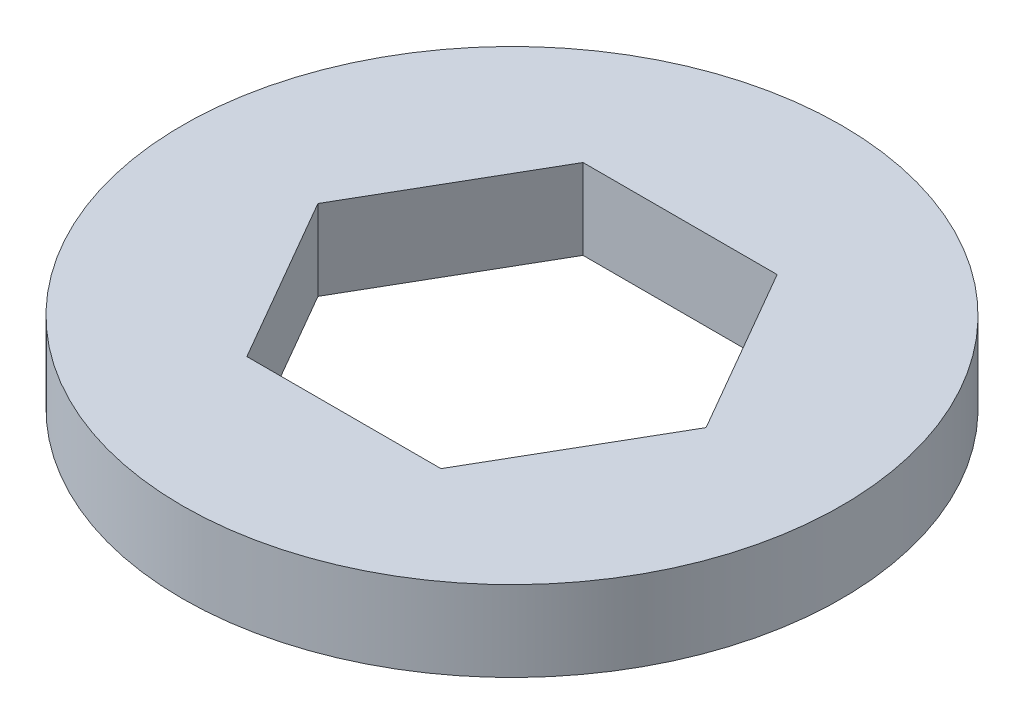
ISO-10303-21;
HEADER;
FILE_DESCRIPTION(('STEP AP214'),'2;1');
FILE_NAME('part.step','',(''),(''),'','','');
FILE_SCHEMA(('AUTOMOTIVE_DESIGN { 1 0 10303 214 1 1 1 1 }'));
ENDSEC;
DATA;
#1=APPLICATION_CONTEXT('core data for automotive mechanical design processes');
#2=APPLICATION_PROTOCOL_DEFINITION('international standard','automotive_design',2000,#1);
#3=PRODUCT_CONTEXT('',#1,'mechanical');
#4=PRODUCT('Part','Part','',(#3));
#5=PRODUCT_RELATED_PRODUCT_CATEGORY('part','',(#4));
#6=PRODUCT_DEFINITION_FORMATION('','',#4);
#7=PRODUCT_DEFINITION_CONTEXT('part definition',#1,'design');
#8=PRODUCT_DEFINITION('design','',#6,#7);
#9=PRODUCT_DEFINITION_SHAPE('','',#8);
#10=(LENGTH_UNIT() NAMED_UNIT(*) SI_UNIT(.MILLI.,.METRE.));
#11=(NAMED_UNIT(*) PLANE_ANGLE_UNIT() SI_UNIT($,.RADIAN.));
#12=(NAMED_UNIT(*) SI_UNIT($,.STERADIAN.) SOLID_ANGLE_UNIT());
#13=UNCERTAINTY_MEASURE_WITH_UNIT(LENGTH_MEASURE(1.E-05),#10,'distance_accuracy_value','');
#14=(GEOMETRIC_REPRESENTATION_CONTEXT(3) GLOBAL_UNCERTAINTY_ASSIGNED_CONTEXT((#13)) GLOBAL_UNIT_ASSIGNED_CONTEXT((#10,
#11,#12)) REPRESENTATION_CONTEXT('',''));
#15=CARTESIAN_POINT('',(0.,0.,0.));
#16=DIRECTION('',(0.,0.,1.));
#17=DIRECTION('',(1.,0.,0.));
#18=AXIS2_PLACEMENT_3D('',#15,#16,#17);
#19=CARTESIAN_POINT('',(5.60924654031181,3.1,-3.2385));
#20=DIRECTION('',(-0.866025403784438,0.,0.5));
#21=DIRECTION('',(0.5,0.,0.866025403784439));
#22=AXIS2_PLACEMENT_3D('',#19,#20,#21);
#23=PLANE('',#22);
#24=DIRECTION('',(-0.5,0.,-0.866025403784439));
#25=VECTOR('',#24,1.);
#26=CARTESIAN_POINT('',(5.60924654031181,0.,-3.2385));
#27=LINE('',#26,#25);
#28=CARTESIAN_POINT('',(7.47899538708241,0.,0.));
#29=VERTEX_POINT('',#28);
#30=CARTESIAN_POINT('',(3.7394976935412,0.,-6.477));
#31=VERTEX_POINT('',#30);
#32=EDGE_CURVE('E120',#29,#31,#27,.T.);
#33=ORIENTED_EDGE('',*,*,#32,.F.);
#34=DIRECTION('',(0.,-1.,0.));
#35=VECTOR('',#34,1.);
#36=CARTESIAN_POINT('',(7.47899538708241,3.1,0.));
#37=LINE('',#36,#35);
#38=CARTESIAN_POINT('',(7.47899538708241,3.1,0.));
#39=VERTEX_POINT('',#38);
#40=EDGE_CURVE('E11',#39,#29,#37,.T.);
#41=ORIENTED_EDGE('',*,*,#40,.F.);
#42=DIRECTION('',(-0.5,0.,-0.866025403784439));
#43=VECTOR('',#42,1.);
#44=CARTESIAN_POINT('',(5.60924654031181,3.1,-3.2385));
#45=LINE('',#44,#43);
#46=CARTESIAN_POINT('',(3.7394976935412,3.1,-6.477));
#47=VERTEX_POINT('',#46);
#48=EDGE_CURVE('E137',#39,#47,#45,.T.);
#49=ORIENTED_EDGE('',*,*,#48,.T.);
#50=DIRECTION('',(0.,-1.,0.));
#51=VECTOR('',#50,1.);
#52=CARTESIAN_POINT('',(3.7394976935412,3.1,-6.477));
#53=LINE('',#52,#51);
#54=EDGE_CURVE('E51',#47,#31,#53,.T.);
#55=ORIENTED_EDGE('',*,*,#54,.T.);
#56=EDGE_LOOP('',(#33,#41,#49,#55));
#57=FACE_BOUND('',#56,.T.);
#58=ADVANCED_FACE('F35',(#57),#23,.T.);
#59=CARTESIAN_POINT('',(5.60924654031181,3.1,3.2385));
#60=DIRECTION('',(-0.866025403784439,0.,-0.5));
#61=DIRECTION('',(-0.5,0.,0.866025403784439));
#62=AXIS2_PLACEMENT_3D('',#59,#60,#61);
#63=PLANE('',#62);
#64=DIRECTION('',(0.5,0.,-0.866025403784439));
#65=VECTOR('',#64,1.);
#66=CARTESIAN_POINT('',(5.60924654031181,0.,3.2385));
#67=LINE('',#66,#65);
#68=CARTESIAN_POINT('',(3.73949769354121,0.,6.477));
#69=VERTEX_POINT('',#68);
#70=EDGE_CURVE('E122',#69,#29,#67,.T.);
#71=ORIENTED_EDGE('',*,*,#70,.F.);
#72=DIRECTION('',(0.,-1.,0.));
#73=VECTOR('',#72,1.);
#74=CARTESIAN_POINT('',(3.73949769354121,3.1,6.477));
#75=LINE('',#74,#73);
#76=CARTESIAN_POINT('',(3.73949769354121,3.1,6.477));
#77=VERTEX_POINT('',#76);
#78=EDGE_CURVE('E43',#77,#69,#75,.T.);
#79=ORIENTED_EDGE('',*,*,#78,.F.);
#80=DIRECTION('',(0.5,0.,-0.866025403784439));
#81=VECTOR('',#80,1.);
#82=CARTESIAN_POINT('',(5.60924654031181,3.1,3.2385));
#83=LINE('',#82,#81);
#84=EDGE_CURVE('E226',#77,#39,#83,.T.);
#85=ORIENTED_EDGE('',*,*,#84,.T.);
#86=ORIENTED_EDGE('',*,*,#40,.T.);
#87=EDGE_LOOP('',(#71,#79,#85,#86));
#88=FACE_BOUND('',#87,.T.);
#89=ADVANCED_FACE('F146',(#88),#63,.T.);
#90=CARTESIAN_POINT('',(0.,3.1,6.477));
#91=DIRECTION('',(0.,0.,-1.));
#92=DIRECTION('',(-1.,0.,0.));
#93=AXIS2_PLACEMENT_3D('',#90,#91,#92);
#94=PLANE('',#93);
#95=DIRECTION('',(1.,0.,0.));
#96=VECTOR('',#95,1.);
#97=CARTESIAN_POINT('',(0.,0.,6.477));
#98=LINE('',#97,#96);
#99=CARTESIAN_POINT('',(-3.7394976935412,0.,6.477));
#100=VERTEX_POINT('',#99);
#101=EDGE_CURVE('E125',#100,#69,#98,.T.);
#102=ORIENTED_EDGE('',*,*,#101,.F.);
#103=DIRECTION('',(0.,-1.,0.));
#104=VECTOR('',#103,1.);
#105=CARTESIAN_POINT('',(-3.7394976935412,3.1,6.477));
#106=LINE('',#105,#104);
#107=CARTESIAN_POINT('',(-3.7394976935412,3.1,6.477));
#108=VERTEX_POINT('',#107);
#109=EDGE_CURVE('E98',#108,#100,#106,.T.);
#110=ORIENTED_EDGE('',*,*,#109,.F.);
#111=DIRECTION('',(1.,0.,0.));
#112=VECTOR('',#111,1.);
#113=CARTESIAN_POINT('',(0.,3.1,6.477));
#114=LINE('',#113,#112);
#115=EDGE_CURVE('E109',#108,#77,#114,.T.);
#116=ORIENTED_EDGE('',*,*,#115,.T.);
#117=ORIENTED_EDGE('',*,*,#78,.T.);
#118=EDGE_LOOP('',(#102,#110,#116,#117));
#119=FACE_BOUND('',#118,.T.);
#120=ADVANCED_FACE('F143',(#119),#94,.T.);
#121=CARTESIAN_POINT('',(-5.60924654031181,3.1,3.2385));
#122=DIRECTION('',(0.866025403784438,0.,-0.5));
#123=DIRECTION('',(-0.5,0.,-0.866025403784439));
#124=AXIS2_PLACEMENT_3D('',#121,#122,#123);
#125=PLANE('',#124);
#126=DIRECTION('',(0.5,0.,0.866025403784439));
#127=VECTOR('',#126,1.);
#128=CARTESIAN_POINT('',(-5.60924654031181,0.,3.2385));
#129=LINE('',#128,#127);
#130=CARTESIAN_POINT('',(-7.47899538708241,0.,0.));
#131=VERTEX_POINT('',#130);
#132=EDGE_CURVE('E94',#131,#100,#129,.T.);
#133=ORIENTED_EDGE('',*,*,#132,.F.);
#134=DIRECTION('',(0.,-1.,0.));
#135=VECTOR('',#134,1.);
#136=CARTESIAN_POINT('',(-7.47899538708241,3.1,0.));
#137=LINE('',#136,#135);
#138=CARTESIAN_POINT('',(-7.47899538708241,3.1,0.));
#139=VERTEX_POINT('',#138);
#140=EDGE_CURVE('E89',#139,#131,#137,.T.);
#141=ORIENTED_EDGE('',*,*,#140,.F.);
#142=DIRECTION('',(0.5,0.,0.866025403784439));
#143=VECTOR('',#142,1.);
#144=CARTESIAN_POINT('',(-5.60924654031181,3.1,3.2385));
#145=LINE('',#144,#143);
#146=EDGE_CURVE('E92',#139,#108,#145,.T.);
#147=ORIENTED_EDGE('',*,*,#146,.T.);
#148=ORIENTED_EDGE('',*,*,#109,.T.);
#149=EDGE_LOOP('',(#133,#141,#147,#148));
#150=FACE_BOUND('',#149,.T.);
#151=ADVANCED_FACE('F91',(#150),#125,.T.);
#152=CARTESIAN_POINT('',(-5.60924654031181,3.1,-3.2385));
#153=DIRECTION('',(0.866025403784439,0.,0.5));
#154=DIRECTION('',(0.5,0.,-0.866025403784439));
#155=AXIS2_PLACEMENT_3D('',#152,#153,#154);
#156=PLANE('',#155);
#157=DIRECTION('',(-0.5,0.,0.866025403784439));
#158=VECTOR('',#157,1.);
#159=CARTESIAN_POINT('',(-5.60924654031181,0.,-3.2385));
#160=LINE('',#159,#158);
#161=CARTESIAN_POINT('',(-3.7394976935412,0.,-6.477));
#162=VERTEX_POINT('',#161);
#163=EDGE_CURVE('E129',#162,#131,#160,.T.);
#164=ORIENTED_EDGE('',*,*,#163,.F.);
#165=DIRECTION('',(0.,-1.,0.));
#166=VECTOR('',#165,1.);
#167=CARTESIAN_POINT('',(-3.7394976935412,3.1,-6.477));
#168=LINE('',#167,#166);
#169=CARTESIAN_POINT('',(-3.7394976935412,3.1,-6.477));
#170=VERTEX_POINT('',#169);
#171=EDGE_CURVE('E70',#170,#162,#168,.T.);
#172=ORIENTED_EDGE('',*,*,#171,.F.);
#173=DIRECTION('',(-0.5,0.,0.866025403784439));
#174=VECTOR('',#173,1.);
#175=CARTESIAN_POINT('',(-5.60924654031181,3.1,-3.2385));
#176=LINE('',#175,#174);
#177=EDGE_CURVE('E106',#170,#139,#176,.T.);
#178=ORIENTED_EDGE('',*,*,#177,.T.);
#179=ORIENTED_EDGE('',*,*,#140,.T.);
#180=EDGE_LOOP('',(#164,#172,#178,#179));
#181=FACE_BOUND('',#180,.T.);
#182=ADVANCED_FACE('F111',(#181),#156,.T.);
#183=CARTESIAN_POINT('',(0.,3.1,-6.477));
#184=DIRECTION('',(0.,0.,1.));
#185=DIRECTION('',(1.,0.,0.));
#186=AXIS2_PLACEMENT_3D('',#183,#184,#185);
#187=PLANE('',#186);
#188=DIRECTION('',(-1.,0.,0.));
#189=VECTOR('',#188,1.);
#190=CARTESIAN_POINT('',(0.,0.,-6.477));
#191=LINE('',#190,#189);
#192=EDGE_CURVE('E131',#31,#162,#191,.T.);
#193=ORIENTED_EDGE('',*,*,#192,.F.);
#194=ORIENTED_EDGE('',*,*,#54,.F.);
#195=DIRECTION('',(-1.,0.,0.));
#196=VECTOR('',#195,1.);
#197=CARTESIAN_POINT('',(0.,3.1,-6.477));
#198=LINE('',#197,#196);
#199=EDGE_CURVE('E112',#47,#170,#198,.T.);
#200=ORIENTED_EDGE('',*,*,#199,.T.);
#201=ORIENTED_EDGE('',*,*,#171,.T.);
#202=EDGE_LOOP('',(#193,#194,#200,#201));
#203=FACE_BOUND('',#202,.T.);
#204=ADVANCED_FACE('F150',(#203),#187,.T.);
#205=CARTESIAN_POINT('',(0.,3.1,0.));
#206=DIRECTION('',(0.,-1.,0.));
#207=DIRECTION('',(0.,0.,-1.));
#208=AXIS2_PLACEMENT_3D('',#205,#206,#207);
#209=CYLINDRICAL_SURFACE('',#208,12.7);
#210=CARTESIAN_POINT('',(0.,3.1,0.));
#211=DIRECTION('',(0.,1.,0.));
#212=DIRECTION('',(0.,0.,1.));
#213=AXIS2_PLACEMENT_3D('',#210,#211,#212);
#214=CIRCLE('',#213,12.7);
#215=CARTESIAN_POINT('',(0.,3.1,-12.7));
#216=VERTEX_POINT('',#215);
#217=EDGE_CURVE('E114',#216,#216,#214,.T.);
#218=CARTESIAN_POINT('',(0.,0.,0.));
#219=DIRECTION('',(0.,1.,0.));
#220=DIRECTION('',(0.,0.,1.));
#221=AXIS2_PLACEMENT_3D('',#218,#219,#220);
#222=CIRCLE('',#221,12.7);
#223=CARTESIAN_POINT('',(0.,0.,-12.7));
#224=VERTEX_POINT('',#223);
#225=EDGE_CURVE('E134',#224,#224,#222,.T.);
#226=CARTESIAN_POINT('',(0.,3.1,-12.7));
#227=CARTESIAN_POINT('',(0.,3.06770833333333,-12.7));
#228=CARTESIAN_POINT('',(0.,3.03541666666667,-12.7));
#229=CARTESIAN_POINT('',(0.,2.97083333333333,-12.7));
#230=CARTESIAN_POINT('',(0.,2.93854166666667,-12.7));
#231=CARTESIAN_POINT('',(0.,2.87395833333333,-12.7));
#232=CARTESIAN_POINT('',(0.,2.84166666666667,-12.7));
#233=CARTESIAN_POINT('',(0.,2.77708333333333,-12.7));
#234=CARTESIAN_POINT('',(0.,2.74479166666667,-12.7));
#235=CARTESIAN_POINT('',(0.,2.68020833333333,-12.7));
#236=CARTESIAN_POINT('',(0.,2.64791666666667,-12.7));
#237=CARTESIAN_POINT('',(0.,2.58333333333333,-12.7));
#238=CARTESIAN_POINT('',(0.,2.55104166666667,-12.7));
#239=CARTESIAN_POINT('',(0.,2.48645833333333,-12.7));
#240=CARTESIAN_POINT('',(0.,2.45416666666667,-12.7));
#241=CARTESIAN_POINT('',(0.,2.38958333333333,-12.7));
#242=CARTESIAN_POINT('',(0.,2.35729166666667,-12.7));
#243=CARTESIAN_POINT('',(0.,2.29270833333333,-12.7));
#244=CARTESIAN_POINT('',(0.,2.26041666666667,-12.7));
#245=CARTESIAN_POINT('',(0.,2.19583333333333,-12.7));
#246=CARTESIAN_POINT('',(0.,2.16354166666667,-12.7));
#247=CARTESIAN_POINT('',(0.,2.09895833333333,-12.7));
#248=CARTESIAN_POINT('',(0.,2.06666666666667,-12.7));
#249=CARTESIAN_POINT('',(0.,2.00208333333333,-12.7));
#250=CARTESIAN_POINT('',(0.,1.96979166666667,-12.7));
#251=CARTESIAN_POINT('',(0.,1.90520833333333,-12.7));
#252=CARTESIAN_POINT('',(0.,1.87291666666667,-12.7));
#253=CARTESIAN_POINT('',(0.,1.80833333333333,-12.7));
#254=CARTESIAN_POINT('',(0.,1.77604166666667,-12.7));
#255=CARTESIAN_POINT('',(0.,1.71145833333333,-12.7));
#256=CARTESIAN_POINT('',(0.,1.67916666666667,-12.7));
#257=CARTESIAN_POINT('',(0.,1.61458333333333,-12.7));
#258=CARTESIAN_POINT('',(0.,1.58229166666667,-12.7));
#259=CARTESIAN_POINT('',(0.,1.51770833333333,-12.7));
#260=CARTESIAN_POINT('',(0.,1.48541666666667,-12.7));
#261=CARTESIAN_POINT('',(0.,1.42083333333333,-12.7));
#262=CARTESIAN_POINT('',(0.,1.38854166666667,-12.7));
#263=CARTESIAN_POINT('',(0.,1.32395833333333,-12.7));
#264=CARTESIAN_POINT('',(0.,1.29166666666667,-12.7));
#265=CARTESIAN_POINT('',(0.,1.22708333333333,-12.7));
#266=CARTESIAN_POINT('',(0.,1.19479166666667,-12.7));
#267=CARTESIAN_POINT('',(0.,1.13020833333333,-12.7));
#268=CARTESIAN_POINT('',(0.,1.09791666666667,-12.7));
#269=CARTESIAN_POINT('',(0.,1.03333333333333,-12.7));
#270=CARTESIAN_POINT('',(0.,1.00104166666667,-12.7));
#271=CARTESIAN_POINT('',(0.,0.936458333333333,-12.7));
#272=CARTESIAN_POINT('',(0.,0.904166666666667,-12.7));
#273=CARTESIAN_POINT('',(0.,0.839583333333333,-12.7));
#274=CARTESIAN_POINT('',(0.,0.807291666666667,-12.7));
#275=CARTESIAN_POINT('',(0.,0.742708333333333,-12.7));
#276=CARTESIAN_POINT('',(0.,0.710416666666667,-12.7));
#277=CARTESIAN_POINT('',(0.,0.645833333333333,-12.7));
#278=CARTESIAN_POINT('',(0.,0.613541666666667,-12.7));
#279=CARTESIAN_POINT('',(0.,0.548958333333333,-12.7));
#280=CARTESIAN_POINT('',(0.,0.516666666666667,-12.7));
#281=CARTESIAN_POINT('',(0.,0.452083333333333,-12.7));
#282=CARTESIAN_POINT('',(0.,0.419791666666667,-12.7));
#283=CARTESIAN_POINT('',(0.,0.355208333333333,-12.7));
#284=CARTESIAN_POINT('',(0.,0.322916666666667,-12.7));
#285=CARTESIAN_POINT('',(0.,0.258333333333333,-12.7));
#286=CARTESIAN_POINT('',(0.,0.226041666666667,-12.7));
#287=CARTESIAN_POINT('',(0.,0.161458333333333,-12.7));
#288=CARTESIAN_POINT('',(0.,0.129166666666667,-12.7));
#289=CARTESIAN_POINT('',(0.,0.0645833333333335,-12.7));
#290=CARTESIAN_POINT('',(0.,0.0322916666666667,-12.7));
#291=CARTESIAN_POINT('',(0.,0.,-12.7));
#292=B_SPLINE_CURVE_WITH_KNOTS('',3,(#226,#227,#228,#229,#230,#231,#232,#233,#234,#235,#236,
#237,#238,#239,#240,#241,#242,#243,#244,#245,#246,#247,#248,#249,#250,#251,#252,#253,#254,#255,
#256,#257,#258,#259,#260,#261,#262,#263,#264,#265,#266,#267,#268,#269,#270,#271,#272,#273,#274,
#275,#276,#277,#278,#279,#280,#281,#282,#283,#284,#285,#286,#287,#288,#289,#290,#291),
.UNSPECIFIED.,.F.,.F.,(4,2,2,2,2,2,2,2,2,2,2,2,2,2,2,2,2,2,2,2,2,2,2,2,2,2,2,2,2,2,2,2,4),(0.,
0.0968749999999997,0.19375,0.290625,0.3875,0.484375,0.58125,0.678125,0.775,0.871874999999999,
0.96875,1.065625,1.1625,1.259375,1.35625,1.453125,1.55,1.646875,1.74375,1.840625,1.9375,
2.034375,2.13125,2.228125,2.325,2.421875,2.51875,2.615625,2.7125,2.809375,2.90625,3.003125,3.1),.UNSPECIFIED.);
#293=EDGE_CURVE('BSEAM152',#216,#224,#292,.T.);
#294=ORIENTED_EDGE('',*,*,#217,.F.);
#295=ORIENTED_EDGE('',*,*,#225,.T.);
#296=ORIENTED_EDGE('',*,*,#293,.T.);
#297=ORIENTED_EDGE('',*,*,#293,.F.);
#298=EDGE_LOOP('',(#294,#296,#295,#297));
#299=FACE_BOUND('',#298,.T.);
#300=ADVANCED_FACE('F152',(#299),#209,.T.);
#301=CARTESIAN_POINT('',(0.,3.1,0.));
#302=DIRECTION('',(0.,1.,0.));
#303=DIRECTION('',(0.,0.,1.));
#304=AXIS2_PLACEMENT_3D('',#301,#302,#303);
#305=PLANE('',#304);
#306=ORIENTED_EDGE('',*,*,#48,.F.);
#307=ORIENTED_EDGE('',*,*,#84,.F.);
#308=ORIENTED_EDGE('',*,*,#115,.F.);
#309=ORIENTED_EDGE('',*,*,#146,.F.);
#310=ORIENTED_EDGE('',*,*,#177,.F.);
#311=ORIENTED_EDGE('',*,*,#199,.F.);
#312=EDGE_LOOP('',(#306,#307,#308,#309,#310,#311));
#313=FACE_BOUND('',#312,.T.);
#314=ORIENTED_EDGE('',*,*,#217,.T.);
#315=EDGE_LOOP('',(#314));
#316=FACE_BOUND('',#315,.T.);
#317=ADVANCED_FACE('F103',(#313,#316),#305,.T.);
#318=CARTESIAN_POINT('',(0.,0.,0.));
#319=DIRECTION('',(0.,1.,0.));
#320=DIRECTION('',(0.,0.,1.));
#321=AXIS2_PLACEMENT_3D('',#318,#319,#320);
#322=PLANE('',#321);
#323=ORIENTED_EDGE('',*,*,#32,.T.);
#324=ORIENTED_EDGE('',*,*,#192,.T.);
#325=ORIENTED_EDGE('',*,*,#163,.T.);
#326=ORIENTED_EDGE('',*,*,#132,.T.);
#327=ORIENTED_EDGE('',*,*,#101,.T.);
#328=ORIENTED_EDGE('',*,*,#70,.T.);
#329=EDGE_LOOP('',(#323,#324,#325,#326,#327,#328));
#330=FACE_BOUND('',#329,.T.);
#331=ORIENTED_EDGE('',*,*,#225,.F.);
#332=EDGE_LOOP('',(#331));
#333=FACE_BOUND('',#332,.T.);
#334=ADVANCED_FACE('F148',(#330,#333),#322,.F.);
#335=CLOSED_SHELL('',(#58,#89,#120,#151,#182,#204,#300,#317,#334));
#336=MANIFOLD_SOLID_BREP('B2',#335);
#337=ADVANCED_BREP_SHAPE_REPRESENTATION('',(#18,#336),#14);
#338=SHAPE_DEFINITION_REPRESENTATION(#9,#337);
ENDSEC;
END-ISO-10303-21;
